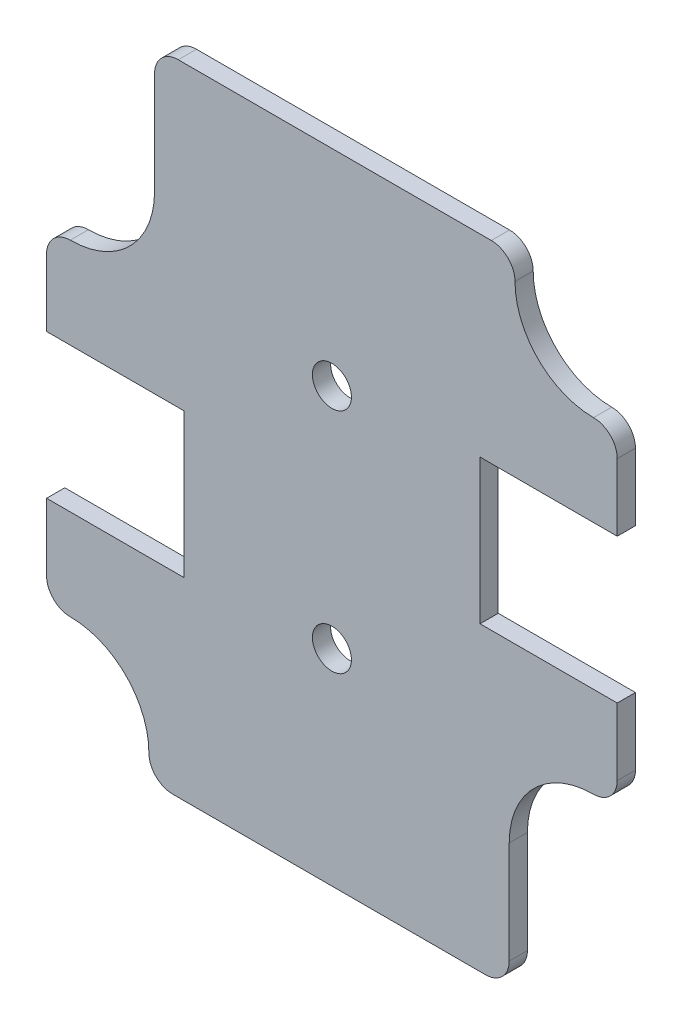
ISO-10303-21;
HEADER;
FILE_DESCRIPTION(('STEP AP214'),'2;1');
FILE_NAME('part.step','',(''),(''),'','','');
FILE_SCHEMA(('AUTOMOTIVE_DESIGN { 1 0 10303 214 1 1 1 1 }'));
ENDSEC;
DATA;
#1=APPLICATION_CONTEXT('core data for automotive mechanical design processes');
#2=APPLICATION_PROTOCOL_DEFINITION('international standard','automotive_design',2000,#1);
#3=PRODUCT_CONTEXT('',#1,'mechanical');
#4=PRODUCT('Part','Part','',(#3));
#5=PRODUCT_RELATED_PRODUCT_CATEGORY('part','',(#4));
#6=PRODUCT_DEFINITION_FORMATION('','',#4);
#7=PRODUCT_DEFINITION_CONTEXT('part definition',#1,'design');
#8=PRODUCT_DEFINITION('design','',#6,#7);
#9=PRODUCT_DEFINITION_SHAPE('','',#8);
#10=(LENGTH_UNIT() NAMED_UNIT(*) SI_UNIT(.MILLI.,.METRE.));
#11=(NAMED_UNIT(*) PLANE_ANGLE_UNIT() SI_UNIT($,.RADIAN.));
#12=(NAMED_UNIT(*) SI_UNIT($,.STERADIAN.) SOLID_ANGLE_UNIT());
#13=UNCERTAINTY_MEASURE_WITH_UNIT(LENGTH_MEASURE(1.E-05),#10,'distance_accuracy_value','');
#14=(GEOMETRIC_REPRESENTATION_CONTEXT(3) GLOBAL_UNCERTAINTY_ASSIGNED_CONTEXT((#13)) GLOBAL_UNIT_ASSIGNED_CONTEXT((#10,
#11,#12)) REPRESENTATION_CONTEXT('',''));
#15=CARTESIAN_POINT('',(0.,0.,0.));
#16=DIRECTION('',(0.,0.,1.));
#17=DIRECTION('',(1.,0.,0.));
#18=AXIS2_PLACEMENT_3D('',#15,#16,#17);
#19=CARTESIAN_POINT('',(1.59314827381188E-11,2.48006036290823E-05,1.6002));
#20=DIRECTION('',(-6.42382861981376E-07,-0.999999999999794,0.));
#21=DIRECTION('',(0.999999999999794,-6.42382861981376E-07,0.));
#22=AXIS2_PLACEMENT_3D('',#19,#20,#21);
#23=PLANE('',#22);
#24=DIRECTION('',(-0.999999999999794,6.42382861981376E-07,0.));
#25=VECTOR('',#24,1.);
#26=CARTESIAN_POINT('',(1.59314827381188E-11,2.48006036290823E-05,0.));
#27=LINE('',#26,#25);
#28=CARTESIAN_POINT('',(38.6072,0.,0.));
#29=VERTEX_POINT('',#28);
#30=CARTESIAN_POINT('',(11.082800196391,1.76812027201656E-05,0.));
#31=VERTEX_POINT('',#30);
#32=EDGE_CURVE('E257',#29,#31,#27,.T.);
#33=ORIENTED_EDGE('',*,*,#32,.F.);
#34=DIRECTION('',(0.,0.,-1.));
#35=VECTOR('',#34,1.);
#36=CARTESIAN_POINT('',(38.6072,0.,1.6002));
#37=LINE('',#36,#35);
#38=CARTESIAN_POINT('',(38.6072,0.,1.6002));
#39=VERTEX_POINT('',#38);
#40=EDGE_CURVE('E11',#39,#29,#37,.T.);
#41=ORIENTED_EDGE('',*,*,#40,.F.);
#42=DIRECTION('',(-0.999999999999794,6.42382861981376E-07,0.));
#43=VECTOR('',#42,1.);
#44=CARTESIAN_POINT('',(1.59314827381188E-11,2.48006036290823E-05,1.6002));
#45=LINE('',#44,#43);
#46=CARTESIAN_POINT('',(11.082800196391,1.76812027201656E-05,1.6002));
#47=VERTEX_POINT('',#46);
#48=EDGE_CURVE('E510',#39,#47,#45,.T.);
#49=ORIENTED_EDGE('',*,*,#48,.T.);
#50=DIRECTION('',(0.,0.,-1.));
#51=VECTOR('',#50,1.);
#52=CARTESIAN_POINT('',(11.082800196391,1.76812027201656E-05,1.6002));
#53=LINE('',#52,#51);
#54=EDGE_CURVE('E150',#47,#31,#53,.T.);
#55=ORIENTED_EDGE('',*,*,#54,.T.);
#56=EDGE_LOOP('',(#33,#41,#49,#55));
#57=FACE_BOUND('',#56,.T.);
#58=ADVANCED_FACE('F41',(#57),#23,.T.);
#59=CARTESIAN_POINT('',(38.6072,2.0828,1.6002));
#60=DIRECTION('',(0.,0.,-1.));
#61=DIRECTION('',(-1.,0.,0.));
#62=AXIS2_PLACEMENT_3D('',#59,#60,#61);
#63=CYLINDRICAL_SURFACE('',#62,2.0828);
#64=CARTESIAN_POINT('',(38.6072,2.0828,0.));
#65=DIRECTION('',(0.,0.,1.));
#66=DIRECTION('',(1.,0.,0.));
#67=AXIS2_PLACEMENT_3D('',#64,#65,#66);
#68=CIRCLE('',#67,2.0828);
#69=CARTESIAN_POINT('',(40.69,2.0828,0.));
#70=VERTEX_POINT('',#69);
#71=EDGE_CURVE('E260',#29,#70,#68,.T.);
#72=ORIENTED_EDGE('',*,*,#71,.T.);
#73=DIRECTION('',(0.,0.,-1.));
#74=VECTOR('',#73,1.);
#75=CARTESIAN_POINT('',(40.69,2.0828,1.6002));
#76=LINE('',#75,#74);
#77=CARTESIAN_POINT('',(40.69,2.0828,1.6002));
#78=VERTEX_POINT('',#77);
#79=EDGE_CURVE('E53',#78,#70,#76,.T.);
#80=ORIENTED_EDGE('',*,*,#79,.F.);
#81=CARTESIAN_POINT('',(38.6072,2.0828,1.6002));
#82=DIRECTION('',(0.,0.,1.));
#83=DIRECTION('',(1.,0.,0.));
#84=AXIS2_PLACEMENT_3D('',#81,#82,#83);
#85=CIRCLE('',#84,2.0828);
#86=EDGE_CURVE('E507',#39,#78,#85,.T.);
#87=ORIENTED_EDGE('',*,*,#86,.F.);
#88=ORIENTED_EDGE('',*,*,#40,.T.);
#89=EDGE_LOOP('',(#72,#80,#87,#88));
#90=FACE_BOUND('',#89,.T.);
#91=ADVANCED_FACE('F481',(#90),#63,.T.);
#92=CARTESIAN_POINT('',(40.69,0.,1.6002));
#93=DIRECTION('',(1.,0.,0.));
#94=DIRECTION('',(0.,0.,-1.));
#95=AXIS2_PLACEMENT_3D('',#92,#93,#94);
#96=PLANE('',#95);
#97=DIRECTION('',(0.,-1.,0.));
#98=VECTOR('',#97,1.);
#99=CARTESIAN_POINT('',(40.69,0.,0.));
#100=LINE('',#99,#98);
#101=CARTESIAN_POINT('',(40.69,11.0832,0.));
#102=VERTEX_POINT('',#101);
#103=EDGE_CURVE('E263',#102,#70,#100,.T.);
#104=ORIENTED_EDGE('',*,*,#103,.F.);
#105=DIRECTION('',(0.,0.,-1.));
#106=VECTOR('',#105,1.);
#107=CARTESIAN_POINT('',(40.69,11.0832,1.6002));
#108=LINE('',#107,#106);
#109=CARTESIAN_POINT('',(40.69,11.0832,1.6002));
#110=VERTEX_POINT('',#109);
#111=EDGE_CURVE('E379',#110,#102,#108,.T.);
#112=ORIENTED_EDGE('',*,*,#111,.F.);
#113=DIRECTION('',(0.,-1.,0.));
#114=VECTOR('',#113,1.);
#115=CARTESIAN_POINT('',(40.69,0.,1.6002));
#116=LINE('',#115,#114);
#117=EDGE_CURVE('E509',#110,#78,#116,.T.);
#118=ORIENTED_EDGE('',*,*,#117,.T.);
#119=ORIENTED_EDGE('',*,*,#79,.T.);
#120=EDGE_LOOP('',(#104,#112,#118,#119));
#121=FACE_BOUND('',#120,.T.);
#122=ADVANCED_FACE('F477',(#121),#96,.T.);
#123=CARTESIAN_POINT('',(48.1068,11.0832000095971,1.6002));
#124=DIRECTION('',(0.,0.,-1.));
#125=DIRECTION('',(-1.,0.,0.));
#126=AXIS2_PLACEMENT_3D('',#123,#124,#125);
#127=CYLINDRICAL_SURFACE('',#126,7.4168);
#128=CARTESIAN_POINT('',(48.1068,11.0832000095971,0.));
#129=DIRECTION('',(0.,0.,1.));
#130=DIRECTION('',(1.,0.,0.));
#131=AXIS2_PLACEMENT_3D('',#128,#129,#130);
#132=CIRCLE('',#131,7.4168);
#133=CARTESIAN_POINT('',(48.1068000463546,18.5000000095971,0.));
#134=VERTEX_POINT('',#133);
#135=EDGE_CURVE('E266',#134,#102,#132,.T.);
#136=ORIENTED_EDGE('',*,*,#135,.F.);
#137=DIRECTION('',(0.,0.,-1.));
#138=VECTOR('',#137,1.);
#139=CARTESIAN_POINT('',(48.1068000463546,18.5000000095971,1.6002));
#140=LINE('',#139,#138);
#141=CARTESIAN_POINT('',(48.1068000463546,18.5000000095971,1.6002));
#142=VERTEX_POINT('',#141);
#143=EDGE_CURVE('E377',#142,#134,#140,.T.);
#144=ORIENTED_EDGE('',*,*,#143,.F.);
#145=CARTESIAN_POINT('',(48.1068,11.0832000095971,1.6002));
#146=DIRECTION('',(0.,0.,1.));
#147=DIRECTION('',(1.,0.,0.));
#148=AXIS2_PLACEMENT_3D('',#145,#146,#147);
#149=CIRCLE('',#148,7.4168);
#150=EDGE_CURVE('E517',#142,#110,#149,.T.);
#151=ORIENTED_EDGE('',*,*,#150,.T.);
#152=ORIENTED_EDGE('',*,*,#111,.T.);
#153=EDGE_LOOP('',(#136,#144,#151,#152));
#154=FACE_BOUND('',#153,.T.);
#155=ADVANCED_FACE('F473',(#154),#127,.F.);
#156=CARTESIAN_POINT('',(48.107,20.583,1.6002));
#157=DIRECTION('',(0.,0.,-1.));
#158=DIRECTION('',(-1.,0.,0.));
#159=AXIS2_PLACEMENT_3D('',#156,#157,#158);
#160=CYLINDRICAL_SURFACE('',#159,2.083);
#161=CARTESIAN_POINT('',(48.107,20.583,0.));
#162=DIRECTION('',(0.,0.,1.));
#163=DIRECTION('',(1.,0.,0.));
#164=AXIS2_PLACEMENT_3D('',#161,#162,#163);
#165=CIRCLE('',#164,2.083);
#166=CARTESIAN_POINT('',(50.1899999904029,20.5828000463545,0.));
#167=VERTEX_POINT('',#166);
#168=EDGE_CURVE('E269',#134,#167,#165,.T.);
#169=ORIENTED_EDGE('',*,*,#168,.T.);
#170=DIRECTION('',(0.,0.,-1.));
#171=VECTOR('',#170,1.);
#172=CARTESIAN_POINT('',(50.1899999904029,20.5828000463545,1.6002));
#173=LINE('',#172,#171);
#174=CARTESIAN_POINT('',(50.1899999904029,20.5828000463545,1.6002));
#175=VERTEX_POINT('',#174);
#176=EDGE_CURVE('E375',#175,#167,#173,.T.);
#177=ORIENTED_EDGE('',*,*,#176,.F.);
#178=CARTESIAN_POINT('',(48.107,20.583,1.6002));
#179=DIRECTION('',(0.,0.,1.));
#180=DIRECTION('',(1.,0.,0.));
#181=AXIS2_PLACEMENT_3D('',#178,#179,#180);
#182=CIRCLE('',#181,2.083);
#183=EDGE_CURVE('E520',#142,#175,#182,.T.);
#184=ORIENTED_EDGE('',*,*,#183,.F.);
#185=ORIENTED_EDGE('',*,*,#143,.T.);
#186=EDGE_LOOP('',(#169,#177,#184,#185));
#187=FACE_BOUND('',#186,.T.);
#188=ADVANCED_FACE('F469',(#187),#160,.T.);
#189=CARTESIAN_POINT('',(50.1899999569757,-8.15104410933596E-08,1.6002));
#190=DIRECTION('',(1.,-1.62403748083747E-09,0.));
#191=DIRECTION('',(1.62403748083747E-09,1.,0.));
#192=AXIS2_PLACEMENT_3D('',#189,#190,#191);
#193=PLANE('',#192);
#194=DIRECTION('',(-1.62403748083747E-09,-1.,0.));
#195=VECTOR('',#194,1.);
#196=CARTESIAN_POINT('',(50.1899999569757,-8.15104410933596E-08,0.));
#197=LINE('',#196,#195);
#198=CARTESIAN_POINT('',(50.19,26.4922,0.));
#199=VERTEX_POINT('',#198);
#200=EDGE_CURVE('E272',#199,#167,#197,.T.);
#201=ORIENTED_EDGE('',*,*,#200,.F.);
#202=DIRECTION('',(0.,0.,-1.));
#203=VECTOR('',#202,1.);
#204=CARTESIAN_POINT('',(50.19,26.4922,1.6002));
#205=LINE('',#204,#203);
#206=CARTESIAN_POINT('',(50.19,26.4922,1.6002));
#207=VERTEX_POINT('',#206);
#208=EDGE_CURVE('E373',#207,#199,#205,.T.);
#209=ORIENTED_EDGE('',*,*,#208,.F.);
#210=DIRECTION('',(-1.62403748083747E-09,-1.,0.));
#211=VECTOR('',#210,1.);
#212=CARTESIAN_POINT('',(50.1899999569757,-8.15104410933596E-08,1.6002));
#213=LINE('',#212,#211);
#214=EDGE_CURVE('E522',#207,#175,#213,.T.);
#215=ORIENTED_EDGE('',*,*,#214,.T.);
#216=ORIENTED_EDGE('',*,*,#176,.T.);
#217=EDGE_LOOP('',(#201,#209,#215,#216));
#218=FACE_BOUND('',#217,.T.);
#219=ADVANCED_FACE('F465',(#218),#193,.T.);
#220=CARTESIAN_POINT('',(0.,26.4922,1.6002));
#221=DIRECTION('',(0.,1.,0.));
#222=DIRECTION('',(0.,0.,1.));
#223=AXIS2_PLACEMENT_3D('',#220,#221,#222);
#224=PLANE('',#223);
#225=DIRECTION('',(1.,0.,0.));
#226=VECTOR('',#225,1.);
#227=CARTESIAN_POINT('',(0.,26.4922,0.));
#228=LINE('',#227,#226);
#229=CARTESIAN_POINT('',(38.125,26.4922,0.));
#230=VERTEX_POINT('',#229);
#231=EDGE_CURVE('E275',#230,#199,#228,.T.);
#232=ORIENTED_EDGE('',*,*,#231,.F.);
#233=DIRECTION('',(0.,0.,-1.));
#234=VECTOR('',#233,1.);
#235=CARTESIAN_POINT('',(38.125,26.4922,1.6002));
#236=LINE('',#235,#234);
#237=CARTESIAN_POINT('',(38.125,26.4922,1.6002));
#238=VERTEX_POINT('',#237);
#239=EDGE_CURVE('E371',#238,#230,#236,.T.);
#240=ORIENTED_EDGE('',*,*,#239,.F.);
#241=DIRECTION('',(1.,0.,0.));
#242=VECTOR('',#241,1.);
#243=CARTESIAN_POINT('',(0.,26.4922,1.6002));
#244=LINE('',#243,#242);
#245=EDGE_CURVE('E525',#238,#207,#244,.T.);
#246=ORIENTED_EDGE('',*,*,#245,.T.);
#247=ORIENTED_EDGE('',*,*,#208,.T.);
#248=EDGE_LOOP('',(#232,#240,#246,#247));
#249=FACE_BOUND('',#248,.T.);
#250=ADVANCED_FACE('F461',(#249),#224,.T.);
#251=CARTESIAN_POINT('',(38.125,0.,1.6002));
#252=DIRECTION('',(1.,0.,0.));
#253=DIRECTION('',(0.,0.,-1.));
#254=AXIS2_PLACEMENT_3D('',#251,#252,#253);
#255=PLANE('',#254);
#256=DIRECTION('',(0.,-1.,0.));
#257=VECTOR('',#256,1.);
#258=CARTESIAN_POINT('',(38.125,0.,0.));
#259=LINE('',#258,#257);
#260=CARTESIAN_POINT('',(38.125,39.1922,0.));
#261=VERTEX_POINT('',#260);
#262=EDGE_CURVE('E278',#261,#230,#259,.T.);
#263=ORIENTED_EDGE('',*,*,#262,.F.);
#264=DIRECTION('',(0.,0.,-1.));
#265=VECTOR('',#264,1.);
#266=CARTESIAN_POINT('',(38.125,39.1922,1.6002));
#267=LINE('',#266,#265);
#268=CARTESIAN_POINT('',(38.125,39.1922,1.6002));
#269=VERTEX_POINT('',#268);
#270=EDGE_CURVE('E369',#269,#261,#267,.T.);
#271=ORIENTED_EDGE('',*,*,#270,.F.);
#272=DIRECTION('',(0.,-1.,0.));
#273=VECTOR('',#272,1.);
#274=CARTESIAN_POINT('',(38.125,0.,1.6002));
#275=LINE('',#274,#273);
#276=EDGE_CURVE('E528',#269,#238,#275,.T.);
#277=ORIENTED_EDGE('',*,*,#276,.T.);
#278=ORIENTED_EDGE('',*,*,#239,.T.);
#279=EDGE_LOOP('',(#263,#271,#277,#278));
#280=FACE_BOUND('',#279,.T.);
#281=ADVANCED_FACE('F457',(#280),#255,.T.);
#282=CARTESIAN_POINT('',(0.,39.1922,1.6002));
#283=DIRECTION('',(0.,-1.,0.));
#284=DIRECTION('',(0.,0.,-1.));
#285=AXIS2_PLACEMENT_3D('',#282,#283,#284);
#286=PLANE('',#285);
#287=DIRECTION('',(-1.,0.,0.));
#288=VECTOR('',#287,1.);
#289=CARTESIAN_POINT('',(0.,39.1922,0.));
#290=LINE('',#289,#288);
#291=CARTESIAN_POINT('',(50.19,39.1922,0.));
#292=VERTEX_POINT('',#291);
#293=EDGE_CURVE('E281',#292,#261,#290,.T.);
#294=ORIENTED_EDGE('',*,*,#293,.F.);
#295=DIRECTION('',(0.,0.,-1.));
#296=VECTOR('',#295,1.);
#297=CARTESIAN_POINT('',(50.19,39.1922,1.6002));
#298=LINE('',#297,#296);
#299=CARTESIAN_POINT('',(50.19,39.1922,1.6002));
#300=VERTEX_POINT('',#299);
#301=EDGE_CURVE('E367',#300,#292,#298,.T.);
#302=ORIENTED_EDGE('',*,*,#301,.F.);
#303=DIRECTION('',(-1.,0.,0.));
#304=VECTOR('',#303,1.);
#305=CARTESIAN_POINT('',(0.,39.1922,1.6002));
#306=LINE('',#305,#304);
#307=EDGE_CURVE('E531',#300,#269,#306,.T.);
#308=ORIENTED_EDGE('',*,*,#307,.T.);
#309=ORIENTED_EDGE('',*,*,#270,.T.);
#310=EDGE_LOOP('',(#294,#302,#308,#309));
#311=FACE_BOUND('',#310,.T.);
#312=ADVANCED_FACE('F453',(#311),#286,.T.);
#313=CARTESIAN_POINT('',(50.19,0.,1.6002));
#314=DIRECTION('',(1.,0.,0.));
#315=DIRECTION('',(0.,0.,-1.));
#316=AXIS2_PLACEMENT_3D('',#313,#314,#315);
#317=PLANE('',#316);
#318=DIRECTION('',(0.,-1.,0.));
#319=VECTOR('',#318,1.);
#320=CARTESIAN_POINT('',(50.19,0.,0.));
#321=LINE('',#320,#319);
#322=CARTESIAN_POINT('',(50.19,45.102,0.));
#323=VERTEX_POINT('',#322);
#324=EDGE_CURVE('E284',#323,#292,#321,.T.);
#325=ORIENTED_EDGE('',*,*,#324,.F.);
#326=DIRECTION('',(0.,0.,-1.));
#327=VECTOR('',#326,1.);
#328=CARTESIAN_POINT('',(50.19,45.102,1.6002));
#329=LINE('',#328,#327);
#330=CARTESIAN_POINT('',(50.19,45.102,1.6002));
#331=VERTEX_POINT('',#330);
#332=EDGE_CURVE('E365',#331,#323,#329,.T.);
#333=ORIENTED_EDGE('',*,*,#332,.F.);
#334=DIRECTION('',(0.,-1.,0.));
#335=VECTOR('',#334,1.);
#336=CARTESIAN_POINT('',(50.19,0.,1.6002));
#337=LINE('',#336,#335);
#338=EDGE_CURVE('E534',#331,#300,#337,.T.);
#339=ORIENTED_EDGE('',*,*,#338,.T.);
#340=ORIENTED_EDGE('',*,*,#301,.T.);
#341=EDGE_LOOP('',(#325,#333,#339,#340));
#342=FACE_BOUND('',#341,.T.);
#343=ADVANCED_FACE('F449',(#342),#317,.T.);
#344=CARTESIAN_POINT('',(48.1072000000005,45.1020014027023,1.6002));
#345=DIRECTION('',(0.,0.,-1.));
#346=DIRECTION('',(-1.,0.,0.));
#347=AXIS2_PLACEMENT_3D('',#344,#345,#346);
#348=CYLINDRICAL_SURFACE('',#347,2.0828);
#349=CARTESIAN_POINT('',(48.1072000000005,45.1020014027023,0.));
#350=DIRECTION('',(0.,0.,1.));
#351=DIRECTION('',(1.,0.,0.));
#352=AXIS2_PLACEMENT_3D('',#349,#350,#351);
#353=CIRCLE('',#352,2.0828);
#354=CARTESIAN_POINT('',(48.1071962343985,47.1848014026989,0.));
#355=VERTEX_POINT('',#354);
#356=EDGE_CURVE('E287',#323,#355,#353,.T.);
#357=ORIENTED_EDGE('',*,*,#356,.T.);
#358=DIRECTION('',(0.,0.,-1.));
#359=VECTOR('',#358,1.);
#360=CARTESIAN_POINT('',(48.1071962343985,47.1848014026989,1.6002));
#361=LINE('',#360,#359);
#362=CARTESIAN_POINT('',(48.1071962343985,47.1848014026989,1.6002));
#363=VERTEX_POINT('',#362);
#364=EDGE_CURVE('E363',#363,#355,#361,.T.);
#365=ORIENTED_EDGE('',*,*,#364,.F.);
#366=CARTESIAN_POINT('',(48.1072000000005,45.1020014027023,1.6002));
#367=DIRECTION('',(0.,0.,1.));
#368=DIRECTION('',(1.,0.,0.));
#369=AXIS2_PLACEMENT_3D('',#366,#367,#368);
#370=CIRCLE('',#369,2.0828);
#371=EDGE_CURVE('E537',#331,#363,#370,.T.);
#372=ORIENTED_EDGE('',*,*,#371,.F.);
#373=ORIENTED_EDGE('',*,*,#332,.T.);
#374=EDGE_LOOP('',(#357,#365,#372,#373));
#375=FACE_BOUND('',#374,.T.);
#376=ADVANCED_FACE('F445',(#375),#348,.T.);
#377=CARTESIAN_POINT('',(48.1115985996995,54.0976000008919,1.6002));
#378=DIRECTION('',(0.,0.,-1.));
#379=DIRECTION('',(-1.,0.,0.));
#380=AXIS2_PLACEMENT_3D('',#377,#378,#379);
#381=CYLINDRICAL_SURFACE('',#380,6.9128);
#382=CARTESIAN_POINT('',(48.1115985996995,54.0976000008919,0.));
#383=DIRECTION('',(0.,0.,1.));
#384=DIRECTION('',(1.,0.,0.));
#385=AXIS2_PLACEMENT_3D('',#382,#383,#384);
#386=CIRCLE('',#385,6.9128);
#387=CARTESIAN_POINT('',(41.1988,54.102,0.));
#388=VERTEX_POINT('',#387);
#389=EDGE_CURVE('E290',#388,#355,#386,.T.);
#390=ORIENTED_EDGE('',*,*,#389,.F.);
#391=DIRECTION('',(0.,0.,-1.));
#392=VECTOR('',#391,1.);
#393=CARTESIAN_POINT('',(41.1988,54.102,1.6002));
#394=LINE('',#393,#392);
#395=CARTESIAN_POINT('',(41.1988,54.102,1.6002));
#396=VERTEX_POINT('',#395);
#397=EDGE_CURVE('E361',#396,#388,#394,.T.);
#398=ORIENTED_EDGE('',*,*,#397,.F.);
#399=CARTESIAN_POINT('',(48.1115985996995,54.0976000008919,1.6002));
#400=DIRECTION('',(0.,0.,1.));
#401=DIRECTION('',(1.,0.,0.));
#402=AXIS2_PLACEMENT_3D('',#399,#400,#401);
#403=CIRCLE('',#402,6.9128);
#404=EDGE_CURVE('E539',#396,#363,#403,.T.);
#405=ORIENTED_EDGE('',*,*,#404,.T.);
#406=ORIENTED_EDGE('',*,*,#364,.T.);
#407=EDGE_LOOP('',(#390,#398,#405,#406));
#408=FACE_BOUND('',#407,.T.);
#409=ADVANCED_FACE('F441',(#408),#381,.F.);
#410=CARTESIAN_POINT('',(39.116,54.102,1.6002));
#411=DIRECTION('',(0.,0.,-1.));
#412=DIRECTION('',(-1.,0.,0.));
#413=AXIS2_PLACEMENT_3D('',#410,#411,#412);
#414=CYLINDRICAL_SURFACE('',#413,2.08280000000001);
#415=CARTESIAN_POINT('',(39.116,54.102,0.));
#416=DIRECTION('',(0.,0.,1.));
#417=DIRECTION('',(1.,0.,0.));
#418=AXIS2_PLACEMENT_3D('',#415,#416,#417);
#419=CIRCLE('',#418,2.08280000000001);
#420=CARTESIAN_POINT('',(39.116,56.1848,0.));
#421=VERTEX_POINT('',#420);
#422=EDGE_CURVE('E293',#388,#421,#419,.T.);
#423=ORIENTED_EDGE('',*,*,#422,.T.);
#424=DIRECTION('',(0.,0.,-1.));
#425=VECTOR('',#424,1.);
#426=CARTESIAN_POINT('',(39.116,56.1848,1.6002));
#427=LINE('',#426,#425);
#428=CARTESIAN_POINT('',(39.116,56.1848,1.6002));
#429=VERTEX_POINT('',#428);
#430=EDGE_CURVE('E359',#429,#421,#427,.T.);
#431=ORIENTED_EDGE('',*,*,#430,.F.);
#432=CARTESIAN_POINT('',(39.116,54.102,1.6002));
#433=DIRECTION('',(0.,0.,1.));
#434=DIRECTION('',(1.,0.,0.));
#435=AXIS2_PLACEMENT_3D('',#432,#433,#434);
#436=CIRCLE('',#435,2.08280000000001);
#437=EDGE_CURVE('E542',#396,#429,#436,.T.);
#438=ORIENTED_EDGE('',*,*,#437,.F.);
#439=ORIENTED_EDGE('',*,*,#397,.T.);
#440=EDGE_LOOP('',(#423,#431,#438,#439));
#441=FACE_BOUND('',#440,.T.);
#442=ADVANCED_FACE('F437',(#441),#414,.T.);
#443=CARTESIAN_POINT('',(0.,56.1848,1.6002));
#444=DIRECTION('',(0.,1.,0.));
#445=DIRECTION('',(-1.,0.,0.));
#446=AXIS2_PLACEMENT_3D('',#443,#444,#445);
#447=PLANE('',#446);
#448=DIRECTION('',(1.,0.,0.));
#449=VECTOR('',#448,1.);
#450=CARTESIAN_POINT('',(0.,56.1848,0.));
#451=LINE('',#450,#449);
#452=CARTESIAN_POINT('',(11.5828,56.1848,0.));
#453=VERTEX_POINT('',#452);
#454=EDGE_CURVE('E296',#453,#421,#451,.T.);
#455=ORIENTED_EDGE('',*,*,#454,.F.);
#456=DIRECTION('',(0.,0.,-1.));
#457=VECTOR('',#456,1.);
#458=CARTESIAN_POINT('',(11.5828,56.1848,1.6002));
#459=LINE('',#458,#457);
#460=CARTESIAN_POINT('',(11.5828,56.1848,1.6002));
#461=VERTEX_POINT('',#460);
#462=EDGE_CURVE('E357',#461,#453,#459,.T.);
#463=ORIENTED_EDGE('',*,*,#462,.F.);
#464=DIRECTION('',(1.,0.,0.));
#465=VECTOR('',#464,1.);
#466=CARTESIAN_POINT('',(0.,56.1848,1.6002));
#467=LINE('',#466,#465);
#468=EDGE_CURVE('E544',#461,#429,#467,.T.);
#469=ORIENTED_EDGE('',*,*,#468,.T.);
#470=ORIENTED_EDGE('',*,*,#430,.T.);
#471=EDGE_LOOP('',(#455,#463,#469,#470));
#472=FACE_BOUND('',#471,.T.);
#473=ADVANCED_FACE('F433',(#472),#447,.T.);
#474=CARTESIAN_POINT('',(11.5828,54.102,1.6002));
#475=DIRECTION('',(0.,0.,-1.));
#476=DIRECTION('',(-1.,0.,0.));
#477=AXIS2_PLACEMENT_3D('',#474,#475,#476);
#478=CYLINDRICAL_SURFACE('',#477,2.0828);
#479=CARTESIAN_POINT('',(11.5828,54.102,0.));
#480=DIRECTION('',(0.,0.,1.));
#481=DIRECTION('',(1.,0.,0.));
#482=AXIS2_PLACEMENT_3D('',#479,#480,#481);
#483=CIRCLE('',#482,2.0828);
#484=CARTESIAN_POINT('',(9.5,54.102,0.));
#485=VERTEX_POINT('',#484);
#486=EDGE_CURVE('E299',#453,#485,#483,.T.);
#487=ORIENTED_EDGE('',*,*,#486,.T.);
#488=DIRECTION('',(0.,0.,-1.));
#489=VECTOR('',#488,1.);
#490=CARTESIAN_POINT('',(9.5,54.102,1.6002));
#491=LINE('',#490,#489);
#492=CARTESIAN_POINT('',(9.5,54.102,1.6002));
#493=VERTEX_POINT('',#492);
#494=EDGE_CURVE('E355',#493,#485,#491,.T.);
#495=ORIENTED_EDGE('',*,*,#494,.F.);
#496=CARTESIAN_POINT('',(11.5828,54.102,1.6002));
#497=DIRECTION('',(0.,0.,1.));
#498=DIRECTION('',(1.,0.,0.));
#499=AXIS2_PLACEMENT_3D('',#496,#497,#498);
#500=CIRCLE('',#499,2.0828);
#501=EDGE_CURVE('E547',#461,#493,#500,.T.);
#502=ORIENTED_EDGE('',*,*,#501,.F.);
#503=ORIENTED_EDGE('',*,*,#462,.T.);
#504=EDGE_LOOP('',(#487,#495,#502,#503));
#505=FACE_BOUND('',#504,.T.);
#506=ADVANCED_FACE('F429',(#505),#478,.T.);
#507=CARTESIAN_POINT('',(9.50000000000001,0.,1.6002));
#508=DIRECTION('',(-1.,0.,0.));
#509=DIRECTION('',(0.,-1.,0.));
#510=AXIS2_PLACEMENT_3D('',#507,#508,#509);
#511=PLANE('',#510);
#512=DIRECTION('',(0.,1.,0.));
#513=VECTOR('',#512,1.);
#514=CARTESIAN_POINT('',(9.50000000000001,0.,0.));
#515=LINE('',#514,#513);
#516=CARTESIAN_POINT('',(9.5,45.1068000000001,0.));
#517=VERTEX_POINT('',#516);
#518=EDGE_CURVE('E302',#517,#485,#515,.T.);
#519=ORIENTED_EDGE('',*,*,#518,.F.);
#520=DIRECTION('',(0.,0.,-1.));
#521=VECTOR('',#520,1.);
#522=CARTESIAN_POINT('',(9.5,45.1068000000001,1.6002));
#523=LINE('',#522,#521);
#524=CARTESIAN_POINT('',(9.5,45.1068000000001,1.6002));
#525=VERTEX_POINT('',#524);
#526=EDGE_CURVE('E353',#525,#517,#523,.T.);
#527=ORIENTED_EDGE('',*,*,#526,.F.);
#528=DIRECTION('',(0.,1.,0.));
#529=VECTOR('',#528,1.);
#530=CARTESIAN_POINT('',(9.50000000000001,0.,1.6002));
#531=LINE('',#530,#529);
#532=EDGE_CURVE('E549',#525,#493,#531,.T.);
#533=ORIENTED_EDGE('',*,*,#532,.T.);
#534=ORIENTED_EDGE('',*,*,#494,.T.);
#535=EDGE_LOOP('',(#519,#527,#533,#534));
#536=FACE_BOUND('',#535,.T.);
#537=ADVANCED_FACE('F425',(#536),#511,.T.);
#538=CARTESIAN_POINT('',(2.0832,45.1067999904029,1.6002));
#539=DIRECTION('',(0.,0.,-1.));
#540=DIRECTION('',(-1.,0.,0.));
#541=AXIS2_PLACEMENT_3D('',#538,#539,#540);
#542=CYLINDRICAL_SURFACE('',#541,7.4168);
#543=CARTESIAN_POINT('',(2.0832,45.1067999904029,0.));
#544=DIRECTION('',(0.,0.,1.));
#545=DIRECTION('',(1.,0.,0.));
#546=AXIS2_PLACEMENT_3D('',#543,#544,#545);
#547=CIRCLE('',#546,7.4168);
#548=CARTESIAN_POINT('',(2.08319995364545,37.6899999904029,0.));
#549=VERTEX_POINT('',#548);
#550=EDGE_CURVE('E305',#549,#517,#547,.T.);
#551=ORIENTED_EDGE('',*,*,#550,.F.);
#552=DIRECTION('',(0.,0.,-1.));
#553=VECTOR('',#552,1.);
#554=CARTESIAN_POINT('',(2.08319995364545,37.6899999904029,1.6002));
#555=LINE('',#554,#553);
#556=CARTESIAN_POINT('',(2.08319995364545,37.6899999904029,1.6002));
#557=VERTEX_POINT('',#556);
#558=EDGE_CURVE('E351',#557,#549,#555,.T.);
#559=ORIENTED_EDGE('',*,*,#558,.F.);
#560=CARTESIAN_POINT('',(2.0832,45.1067999904029,1.6002));
#561=DIRECTION('',(0.,0.,1.));
#562=DIRECTION('',(1.,0.,0.));
#563=AXIS2_PLACEMENT_3D('',#560,#561,#562);
#564=CIRCLE('',#563,7.4168);
#565=EDGE_CURVE('E552',#557,#525,#564,.T.);
#566=ORIENTED_EDGE('',*,*,#565,.T.);
#567=ORIENTED_EDGE('',*,*,#526,.T.);
#568=EDGE_LOOP('',(#551,#559,#566,#567));
#569=FACE_BOUND('',#568,.T.);
#570=ADVANCED_FACE('F421',(#569),#542,.F.);
#571=CARTESIAN_POINT('',(2.083,35.607,1.6002));
#572=DIRECTION('',(0.,0.,-1.));
#573=DIRECTION('',(-1.,0.,0.));
#574=AXIS2_PLACEMENT_3D('',#571,#572,#573);
#575=CYLINDRICAL_SURFACE('',#574,2.083);
#576=CARTESIAN_POINT('',(2.083,35.607,0.));
#577=DIRECTION('',(0.,0.,1.));
#578=DIRECTION('',(1.,0.,0.));
#579=AXIS2_PLACEMENT_3D('',#576,#577,#578);
#580=CIRCLE('',#579,2.083);
#581=CARTESIAN_POINT('',(9.59708623682332E-09,35.6071999536454,0.));
#582=VERTEX_POINT('',#581);
#583=EDGE_CURVE('E308',#549,#582,#580,.T.);
#584=ORIENTED_EDGE('',*,*,#583,.T.);
#585=DIRECTION('',(0.,0.,-1.));
#586=VECTOR('',#585,1.);
#587=CARTESIAN_POINT('',(9.59708623682332E-09,35.6071999536454,1.6002));
#588=LINE('',#587,#586);
#589=CARTESIAN_POINT('',(9.59708623682332E-09,35.6071999536454,1.6002));
#590=VERTEX_POINT('',#589);
#591=EDGE_CURVE('E349',#590,#582,#588,.T.);
#592=ORIENTED_EDGE('',*,*,#591,.F.);
#593=CARTESIAN_POINT('',(2.083,35.607,1.6002));
#594=DIRECTION('',(0.,0.,1.));
#595=DIRECTION('',(1.,0.,0.));
#596=AXIS2_PLACEMENT_3D('',#593,#594,#595);
#597=CIRCLE('',#596,2.083);
#598=EDGE_CURVE('E555',#557,#590,#597,.T.);
#599=ORIENTED_EDGE('',*,*,#598,.F.);
#600=ORIENTED_EDGE('',*,*,#558,.T.);
#601=EDGE_LOOP('',(#584,#592,#599,#600));
#602=FACE_BOUND('',#601,.T.);
#603=ADVANCED_FACE('F417',(#602),#575,.T.);
#604=CARTESIAN_POINT('',(-4.81794956596962E-08,0.,1.6002));
#605=DIRECTION('',(-1.,1.62260952761618E-09,0.));
#606=DIRECTION('',(-1.62260952761618E-09,-1.,0.));
#607=AXIS2_PLACEMENT_3D('',#604,#605,#606);
#608=PLANE('',#607);
#609=DIRECTION('',(1.62260952761618E-09,1.,0.));
#610=VECTOR('',#609,1.);
#611=CARTESIAN_POINT('',(-4.81794956596962E-08,0.,0.));
#612=LINE('',#611,#610);
#613=CARTESIAN_POINT('',(0.,29.6926,0.));
#614=VERTEX_POINT('',#613);
#615=EDGE_CURVE('E311',#614,#582,#612,.T.);
#616=ORIENTED_EDGE('',*,*,#615,.F.);
#617=DIRECTION('',(0.,0.,-1.));
#618=VECTOR('',#617,1.);
#619=CARTESIAN_POINT('',(0.,29.6926,1.6002));
#620=LINE('',#619,#618);
#621=CARTESIAN_POINT('',(0.,29.6926,1.6002));
#622=VERTEX_POINT('',#621);
#623=EDGE_CURVE('E347',#622,#614,#620,.T.);
#624=ORIENTED_EDGE('',*,*,#623,.F.);
#625=DIRECTION('',(1.62260952761618E-09,1.,0.));
#626=VECTOR('',#625,1.);
#627=CARTESIAN_POINT('',(-4.81794956596962E-08,0.,1.6002));
#628=LINE('',#627,#626);
#629=EDGE_CURVE('E557',#622,#590,#628,.T.);
#630=ORIENTED_EDGE('',*,*,#629,.T.);
#631=ORIENTED_EDGE('',*,*,#591,.T.);
#632=EDGE_LOOP('',(#616,#624,#630,#631));
#633=FACE_BOUND('',#632,.T.);
#634=ADVANCED_FACE('F413',(#633),#608,.T.);
#635=CARTESIAN_POINT('',(0.,29.6926,1.6002));
#636=DIRECTION('',(0.,1.,0.));
#637=DIRECTION('',(0.,0.,1.));
#638=AXIS2_PLACEMENT_3D('',#635,#636,#637);
#639=PLANE('',#638);
#640=DIRECTION('',(1.,0.,0.));
#641=VECTOR('',#640,1.);
#642=CARTESIAN_POINT('',(0.,29.6926,0.));
#643=LINE('',#642,#641);
#644=CARTESIAN_POINT('',(12.065,29.6926,0.));
#645=VERTEX_POINT('',#644);
#646=EDGE_CURVE('E314',#614,#645,#643,.T.);
#647=ORIENTED_EDGE('',*,*,#646,.T.);
#648=DIRECTION('',(0.,0.,-1.));
#649=VECTOR('',#648,1.);
#650=CARTESIAN_POINT('',(12.065,29.6926,1.6002));
#651=LINE('',#650,#649);
#652=CARTESIAN_POINT('',(12.065,29.6926,1.6002));
#653=VERTEX_POINT('',#652);
#654=EDGE_CURVE('E344',#653,#645,#651,.T.);
#655=ORIENTED_EDGE('',*,*,#654,.F.);
#656=DIRECTION('',(1.,0.,0.));
#657=VECTOR('',#656,1.);
#658=CARTESIAN_POINT('',(0.,29.6926,1.6002));
#659=LINE('',#658,#657);
#660=EDGE_CURVE('E560',#622,#653,#659,.T.);
#661=ORIENTED_EDGE('',*,*,#660,.F.);
#662=ORIENTED_EDGE('',*,*,#623,.T.);
#663=EDGE_LOOP('',(#647,#655,#661,#662));
#664=FACE_BOUND('',#663,.T.);
#665=ADVANCED_FACE('F409',(#664),#639,.F.);
#666=CARTESIAN_POINT('',(12.065,0.,1.6002));
#667=DIRECTION('',(1.,0.,0.));
#668=DIRECTION('',(0.,0.,-1.));
#669=AXIS2_PLACEMENT_3D('',#666,#667,#668);
#670=PLANE('',#669);
#671=DIRECTION('',(0.,-1.,0.));
#672=VECTOR('',#671,1.);
#673=CARTESIAN_POINT('',(12.065,0.,0.));
#674=LINE('',#673,#672);
#675=CARTESIAN_POINT('',(12.065,16.9926,0.));
#676=VERTEX_POINT('',#675);
#677=EDGE_CURVE('E317',#645,#676,#674,.T.);
#678=ORIENTED_EDGE('',*,*,#677,.T.);
#679=DIRECTION('',(0.,0.,-1.));
#680=VECTOR('',#679,1.);
#681=CARTESIAN_POINT('',(12.065,16.9926,1.6002));
#682=LINE('',#681,#680);
#683=CARTESIAN_POINT('',(12.065,16.9926,1.6002));
#684=VERTEX_POINT('',#683);
#685=EDGE_CURVE('E341',#684,#676,#682,.T.);
#686=ORIENTED_EDGE('',*,*,#685,.F.);
#687=DIRECTION('',(0.,-1.,0.));
#688=VECTOR('',#687,1.);
#689=CARTESIAN_POINT('',(12.065,0.,1.6002));
#690=LINE('',#689,#688);
#691=EDGE_CURVE('E563',#653,#684,#690,.T.);
#692=ORIENTED_EDGE('',*,*,#691,.F.);
#693=ORIENTED_EDGE('',*,*,#654,.T.);
#694=EDGE_LOOP('',(#678,#686,#692,#693));
#695=FACE_BOUND('',#694,.T.);
#696=ADVANCED_FACE('F405',(#695),#670,.F.);
#697=CARTESIAN_POINT('',(0.,16.9926,1.6002));
#698=DIRECTION('',(0.,-1.,0.));
#699=DIRECTION('',(0.,0.,-1.));
#700=AXIS2_PLACEMENT_3D('',#697,#698,#699);
#701=PLANE('',#700);
#702=DIRECTION('',(-1.,0.,0.));
#703=VECTOR('',#702,1.);
#704=CARTESIAN_POINT('',(0.,16.9926,0.));
#705=LINE('',#704,#703);
#706=CARTESIAN_POINT('',(0.,16.9926,0.));
#707=VERTEX_POINT('',#706);
#708=EDGE_CURVE('E320',#676,#707,#705,.T.);
#709=ORIENTED_EDGE('',*,*,#708,.T.);
#710=DIRECTION('',(0.,0.,-1.));
#711=VECTOR('',#710,1.);
#712=CARTESIAN_POINT('',(0.,16.9926,1.6002));
#713=LINE('',#712,#711);
#714=CARTESIAN_POINT('',(0.,16.9926,1.6002));
#715=VERTEX_POINT('',#714);
#716=EDGE_CURVE('E339',#715,#707,#713,.T.);
#717=ORIENTED_EDGE('',*,*,#716,.F.);
#718=DIRECTION('',(-1.,0.,0.));
#719=VECTOR('',#718,1.);
#720=CARTESIAN_POINT('',(0.,16.9926,1.6002));
#721=LINE('',#720,#719);
#722=EDGE_CURVE('E566',#684,#715,#721,.T.);
#723=ORIENTED_EDGE('',*,*,#722,.F.);
#724=ORIENTED_EDGE('',*,*,#685,.T.);
#725=EDGE_LOOP('',(#709,#717,#723,#724));
#726=FACE_BOUND('',#725,.T.);
#727=ADVANCED_FACE('F401',(#726),#701,.F.);
#728=CARTESIAN_POINT('',(5.08392188101735E-05,1.52103043045316E-10,1.6002));
#729=DIRECTION('',(-0.999999999995524,-2.99184461532673E-06,0.));
#730=DIRECTION('',(2.99184461532673E-06,-0.999999999995524,0.));
#731=AXIS2_PLACEMENT_3D('',#728,#729,#730);
#732=PLANE('',#731);
#733=DIRECTION('',(-2.99184461532673E-06,0.999999999995524,0.));
#734=VECTOR('',#733,1.);
#735=CARTESIAN_POINT('',(5.08392188101735E-05,1.52103043045316E-10,0.));
#736=LINE('',#735,#734);
#737=CARTESIAN_POINT('',(1.76812027201656E-05,11.082800196391,0.));
#738=VERTEX_POINT('',#737);
#739=EDGE_CURVE('E323',#738,#707,#736,.T.);
#740=ORIENTED_EDGE('',*,*,#739,.F.);
#741=DIRECTION('',(0.,0.,-1.));
#742=VECTOR('',#741,1.);
#743=CARTESIAN_POINT('',(1.76812027201656E-05,11.082800196391,1.6002));
#744=LINE('',#743,#742);
#745=CARTESIAN_POINT('',(1.76812027201656E-05,11.082800196391,1.6002));
#746=VERTEX_POINT('',#745);
#747=EDGE_CURVE('E241',#746,#738,#744,.T.);
#748=ORIENTED_EDGE('',*,*,#747,.F.);
#749=DIRECTION('',(-2.99184461532673E-06,0.999999999995524,0.));
#750=VECTOR('',#749,1.);
#751=CARTESIAN_POINT('',(5.08392188101735E-05,1.52103043045316E-10,1.6002));
#752=LINE('',#751,#750);
#753=EDGE_CURVE('E229',#746,#715,#752,.T.);
#754=ORIENTED_EDGE('',*,*,#753,.T.);
#755=ORIENTED_EDGE('',*,*,#716,.T.);
#756=EDGE_LOOP('',(#740,#748,#754,#755));
#757=FACE_BOUND('',#756,.T.);
#758=ADVANCED_FACE('F398',(#757),#732,.T.);
#759=CARTESIAN_POINT('',(2.0914,11.0914,1.6002));
#760=DIRECTION('',(0.,0.,-1.));
#761=DIRECTION('',(-1.,0.,0.));
#762=AXIS2_PLACEMENT_3D('',#759,#760,#761);
#763=CYLINDRICAL_SURFACE('',#762,2.0914);
#764=CARTESIAN_POINT('',(2.0914,11.0914,0.));
#765=DIRECTION('',(0.,0.,1.));
#766=DIRECTION('',(1.,0.,0.));
#767=AXIS2_PLACEMENT_3D('',#764,#765,#766);
#768=CIRCLE('',#767,2.0914);
#769=CARTESIAN_POINT('',(2.09999990180444,9.00000884060136,0.));
#770=VERTEX_POINT('',#769);
#771=EDGE_CURVE('E236',#738,#770,#768,.T.);
#772=ORIENTED_EDGE('',*,*,#771,.T.);
#773=CARTESIAN_POINT('',(2.09999990182722,8.99999999999975,1.6002));
#774=DIRECTION('',(0.,0.,-1.));
#775=VECTOR('',#774,1.);
#776=LINE('',#773,#775);
#777=CARTESIAN_POINT('',(2.09999990180444,9.00000884060136,1.6002));
#778=VERTEX_POINT('',#777);
#779=EDGE_CURVE('E233',#778,#770,#776,.T.);
#780=ORIENTED_EDGE('',*,*,#779,.F.);
#781=CARTESIAN_POINT('',(2.0914,11.0914,1.6002));
#782=DIRECTION('',(0.,0.,1.));
#783=DIRECTION('',(1.,0.,0.));
#784=AXIS2_PLACEMENT_3D('',#781,#782,#783);
#785=CIRCLE('',#784,2.0914);
#786=EDGE_CURVE('E223',#746,#778,#785,.T.);
#787=ORIENTED_EDGE('',*,*,#786,.F.);
#788=ORIENTED_EDGE('',*,*,#747,.T.);
#789=EDGE_LOOP('',(#772,#780,#787,#788));
#790=FACE_BOUND('',#789,.T.);
#791=ADVANCED_FACE('F234',(#790),#763,.T.);
#792=CARTESIAN_POINT('',(2.10001768120272,2.10000000002265,1.6002));
#793=DIRECTION('',(0.,0.,-1.));
#794=DIRECTION('',(-1.,0.,0.));
#795=AXIS2_PLACEMENT_3D('',#792,#793,#794);
#796=CYLINDRICAL_SURFACE('',#795,6.9);
#797=CARTESIAN_POINT('',(2.10001768120272,2.10000000002265,0.));
#798=DIRECTION('',(0.,0.,1.));
#799=DIRECTION('',(1.,0.,0.));
#800=AXIS2_PLACEMENT_3D('',#797,#798,#799);
#801=CIRCLE('',#800,6.9);
#802=CARTESIAN_POINT('',(9.00001768120272,2.09999980360897,0.));
#803=VERTEX_POINT('',#802);
#804=EDGE_CURVE('E327',#803,#770,#801,.T.);
#805=ORIENTED_EDGE('',*,*,#804,.F.);
#806=DIRECTION('',(0.,0.,-1.));
#807=VECTOR('',#806,1.);
#808=CARTESIAN_POINT('',(9.00001768120272,2.09999980360897,1.6002));
#809=LINE('',#808,#807);
#810=CARTESIAN_POINT('',(9.00001768120272,2.09999980360897,1.6002));
#811=VERTEX_POINT('',#810);
#812=EDGE_CURVE('E143',#811,#803,#809,.T.);
#813=ORIENTED_EDGE('',*,*,#812,.F.);
#814=CARTESIAN_POINT('',(2.10001768120272,2.10000000002265,1.6002));
#815=DIRECTION('',(0.,0.,1.));
#816=DIRECTION('',(1.,0.,0.));
#817=AXIS2_PLACEMENT_3D('',#814,#815,#816);
#818=CIRCLE('',#817,6.9);
#819=EDGE_CURVE('E227',#811,#778,#818,.T.);
#820=ORIENTED_EDGE('',*,*,#819,.T.);
#821=ORIENTED_EDGE('',*,*,#779,.T.);
#822=EDGE_LOOP('',(#805,#813,#820,#821));
#823=FACE_BOUND('',#822,.T.);
#824=ADVANCED_FACE('F243',(#823),#796,.F.);
#825=CARTESIAN_POINT('',(25.0952,18.0848,1.6002));
#826=DIRECTION('',(0.,0.,-1.));
#827=DIRECTION('',(-1.,0.,0.));
#828=AXIS2_PLACEMENT_3D('',#825,#826,#827);
#829=CYLINDRICAL_SURFACE('',#828,1.7145);
#830=CARTESIAN_POINT('',(25.0952,18.0848,1.6002));
#831=DIRECTION('',(0.,0.,1.));
#832=DIRECTION('',(1.,0.,0.));
#833=AXIS2_PLACEMENT_3D('',#830,#831,#832);
#834=CIRCLE('',#833,1.7145);
#835=CARTESIAN_POINT('',(26.8097,18.0848,1.6002));
#836=VERTEX_POINT('',#835);
#837=EDGE_CURVE('E496',#836,#836,#834,.T.);
#838=ORIENTED_EDGE('',*,*,#837,.T.);
#839=EDGE_LOOP('',(#838));
#840=FACE_BOUND('',#839,.T.);
#841=CARTESIAN_POINT('',(25.0952,18.0848,0.));
#842=DIRECTION('',(0.,0.,1.));
#843=DIRECTION('',(1.,0.,0.));
#844=AXIS2_PLACEMENT_3D('',#841,#842,#843);
#845=CIRCLE('',#844,1.7145);
#846=CARTESIAN_POINT('',(26.8097,18.0848,0.));
#847=VERTEX_POINT('',#846);
#848=EDGE_CURVE('E254',#847,#847,#845,.T.);
#849=ORIENTED_EDGE('',*,*,#848,.F.);
#850=EDGE_LOOP('',(#849));
#851=FACE_BOUND('',#850,.T.);
#852=ADVANCED_FACE('F392',(#840,#851),#829,.F.);
#853=CARTESIAN_POINT('',(25.0952,38.1,1.6002));
#854=DIRECTION('',(0.,0.,-1.));
#855=DIRECTION('',(-1.,0.,0.));
#856=AXIS2_PLACEMENT_3D('',#853,#854,#855);
#857=CYLINDRICAL_SURFACE('',#856,1.7145);
#858=CARTESIAN_POINT('',(25.0952,38.1,1.6002));
#859=DIRECTION('',(0.,0.,1.));
#860=DIRECTION('',(1.,0.,0.));
#861=AXIS2_PLACEMENT_3D('',#858,#859,#860);
#862=CIRCLE('',#861,1.7145);
#863=CARTESIAN_POINT('',(26.8097,38.1,1.6002));
#864=VERTEX_POINT('',#863);
#865=EDGE_CURVE('E335',#864,#864,#862,.T.);
#866=ORIENTED_EDGE('',*,*,#865,.T.);
#867=EDGE_LOOP('',(#866));
#868=FACE_BOUND('',#867,.T.);
#869=CARTESIAN_POINT('',(25.0952,38.1,0.));
#870=DIRECTION('',(0.,0.,1.));
#871=DIRECTION('',(1.,0.,0.));
#872=AXIS2_PLACEMENT_3D('',#869,#870,#871);
#873=CIRCLE('',#872,1.7145);
#874=CARTESIAN_POINT('',(26.8097,38.1,0.));
#875=VERTEX_POINT('',#874);
#876=EDGE_CURVE('E251',#875,#875,#873,.T.);
#877=ORIENTED_EDGE('',*,*,#876,.F.);
#878=EDGE_LOOP('',(#877));
#879=FACE_BOUND('',#878,.T.);
#880=ADVANCED_FACE('F43',(#868,#879),#857,.F.);
#881=CARTESIAN_POINT('',(11.0914,2.0914,1.6002));
#882=DIRECTION('',(0.,0.,-1.));
#883=DIRECTION('',(-1.,0.,0.));
#884=AXIS2_PLACEMENT_3D('',#881,#882,#883);
#885=CYLINDRICAL_SURFACE('',#884,2.0914);
#886=CARTESIAN_POINT('',(11.0914,2.0914,0.));
#887=DIRECTION('',(0.,0.,1.));
#888=DIRECTION('',(1.,0.,0.));
#889=AXIS2_PLACEMENT_3D('',#886,#887,#888);
#890=CIRCLE('',#889,2.0914);
#891=EDGE_CURVE('E331',#803,#31,#890,.T.);
#892=ORIENTED_EDGE('',*,*,#891,.T.);
#893=ORIENTED_EDGE('',*,*,#54,.F.);
#894=CARTESIAN_POINT('',(11.0914,2.0914,1.6002));
#895=DIRECTION('',(0.,0.,1.));
#896=DIRECTION('',(1.,0.,0.));
#897=AXIS2_PLACEMENT_3D('',#894,#895,#896);
#898=CIRCLE('',#897,2.0914);
#899=EDGE_CURVE('E62',#811,#47,#898,.T.);
#900=ORIENTED_EDGE('',*,*,#899,.F.);
#901=ORIENTED_EDGE('',*,*,#812,.T.);
#902=EDGE_LOOP('',(#892,#893,#900,#901));
#903=FACE_BOUND('',#902,.T.);
#904=ADVANCED_FACE('F393',(#903),#885,.T.);
#905=CARTESIAN_POINT('',(0.,0.,1.6002));
#906=DIRECTION('',(0.,0.,1.));
#907=DIRECTION('',(1.,0.,0.));
#908=AXIS2_PLACEMENT_3D('',#905,#906,#907);
#909=PLANE('',#908);
#910=ORIENTED_EDGE('',*,*,#865,.F.);
#911=EDGE_LOOP('',(#910));
#912=FACE_BOUND('',#911,.T.);
#913=ORIENTED_EDGE('',*,*,#837,.F.);
#914=EDGE_LOOP('',(#913));
#915=FACE_BOUND('',#914,.T.);
#916=ORIENTED_EDGE('',*,*,#48,.F.);
#917=ORIENTED_EDGE('',*,*,#86,.T.);
#918=ORIENTED_EDGE('',*,*,#117,.F.);
#919=ORIENTED_EDGE('',*,*,#150,.F.);
#920=ORIENTED_EDGE('',*,*,#183,.T.);
#921=ORIENTED_EDGE('',*,*,#214,.F.);
#922=ORIENTED_EDGE('',*,*,#245,.F.);
#923=ORIENTED_EDGE('',*,*,#276,.F.);
#924=ORIENTED_EDGE('',*,*,#307,.F.);
#925=ORIENTED_EDGE('',*,*,#338,.F.);
#926=ORIENTED_EDGE('',*,*,#371,.T.);
#927=ORIENTED_EDGE('',*,*,#404,.F.);
#928=ORIENTED_EDGE('',*,*,#437,.T.);
#929=ORIENTED_EDGE('',*,*,#468,.F.);
#930=ORIENTED_EDGE('',*,*,#501,.T.);
#931=ORIENTED_EDGE('',*,*,#532,.F.);
#932=ORIENTED_EDGE('',*,*,#565,.F.);
#933=ORIENTED_EDGE('',*,*,#598,.T.);
#934=ORIENTED_EDGE('',*,*,#629,.F.);
#935=ORIENTED_EDGE('',*,*,#660,.T.);
#936=ORIENTED_EDGE('',*,*,#691,.T.);
#937=ORIENTED_EDGE('',*,*,#722,.T.);
#938=ORIENTED_EDGE('',*,*,#753,.F.);
#939=ORIENTED_EDGE('',*,*,#786,.T.);
#940=ORIENTED_EDGE('',*,*,#819,.F.);
#941=ORIENTED_EDGE('',*,*,#899,.T.);
#942=EDGE_LOOP('',(#916,#917,#918,#919,#920,#921,#922,#923,#924,#925,#926,#927,#928,#929,#930,
#931,#932,#933,#934,#935,#936,#937,#938,#939,#940,#941));
#943=FACE_BOUND('',#942,.T.);
#944=ADVANCED_FACE('F225',(#912,#915,#943),#909,.T.);
#945=CARTESIAN_POINT('',(0.,0.,0.));
#946=DIRECTION('',(0.,0.,1.));
#947=DIRECTION('',(1.,0.,0.));
#948=AXIS2_PLACEMENT_3D('',#945,#946,#947);
#949=PLANE('',#948);
#950=ORIENTED_EDGE('',*,*,#876,.T.);
#951=EDGE_LOOP('',(#950));
#952=FACE_BOUND('',#951,.T.);
#953=ORIENTED_EDGE('',*,*,#848,.T.);
#954=EDGE_LOOP('',(#953));
#955=FACE_BOUND('',#954,.T.);
#956=ORIENTED_EDGE('',*,*,#32,.T.);
#957=ORIENTED_EDGE('',*,*,#891,.F.);
#958=ORIENTED_EDGE('',*,*,#804,.T.);
#959=ORIENTED_EDGE('',*,*,#771,.F.);
#960=ORIENTED_EDGE('',*,*,#739,.T.);
#961=ORIENTED_EDGE('',*,*,#708,.F.);
#962=ORIENTED_EDGE('',*,*,#677,.F.);
#963=ORIENTED_EDGE('',*,*,#646,.F.);
#964=ORIENTED_EDGE('',*,*,#615,.T.);
#965=ORIENTED_EDGE('',*,*,#583,.F.);
#966=ORIENTED_EDGE('',*,*,#550,.T.);
#967=ORIENTED_EDGE('',*,*,#518,.T.);
#968=ORIENTED_EDGE('',*,*,#486,.F.);
#969=ORIENTED_EDGE('',*,*,#454,.T.);
#970=ORIENTED_EDGE('',*,*,#422,.F.);
#971=ORIENTED_EDGE('',*,*,#389,.T.);
#972=ORIENTED_EDGE('',*,*,#356,.F.);
#973=ORIENTED_EDGE('',*,*,#324,.T.);
#974=ORIENTED_EDGE('',*,*,#293,.T.);
#975=ORIENTED_EDGE('',*,*,#262,.T.);
#976=ORIENTED_EDGE('',*,*,#231,.T.);
#977=ORIENTED_EDGE('',*,*,#200,.T.);
#978=ORIENTED_EDGE('',*,*,#168,.F.);
#979=ORIENTED_EDGE('',*,*,#135,.T.);
#980=ORIENTED_EDGE('',*,*,#103,.T.);
#981=ORIENTED_EDGE('',*,*,#71,.F.);
#982=EDGE_LOOP('',(#956,#957,#958,#959,#960,#961,#962,#963,#964,#965,#966,#967,#968,#969,#970,
#971,#972,#973,#974,#975,#976,#977,#978,#979,#980,#981));
#983=FACE_BOUND('',#982,.T.);
#984=ADVANCED_FACE('F499',(#952,#955,#983),#949,.F.);
#985=CLOSED_SHELL('',(#58,#91,#122,#155,#188,#219,#250,#281,#312,#343,#376,#409,#442,#473,#506,
#537,#570,#603,#634,#665,#696,#727,#758,#791,#824,#852,#880,#904,#944,#984));
#986=MANIFOLD_SOLID_BREP('B2',#985);
#987=ADVANCED_BREP_SHAPE_REPRESENTATION('',(#18,#986),#14);
#988=SHAPE_DEFINITION_REPRESENTATION(#9,#987);
ENDSEC;
END-ISO-10303-21;
